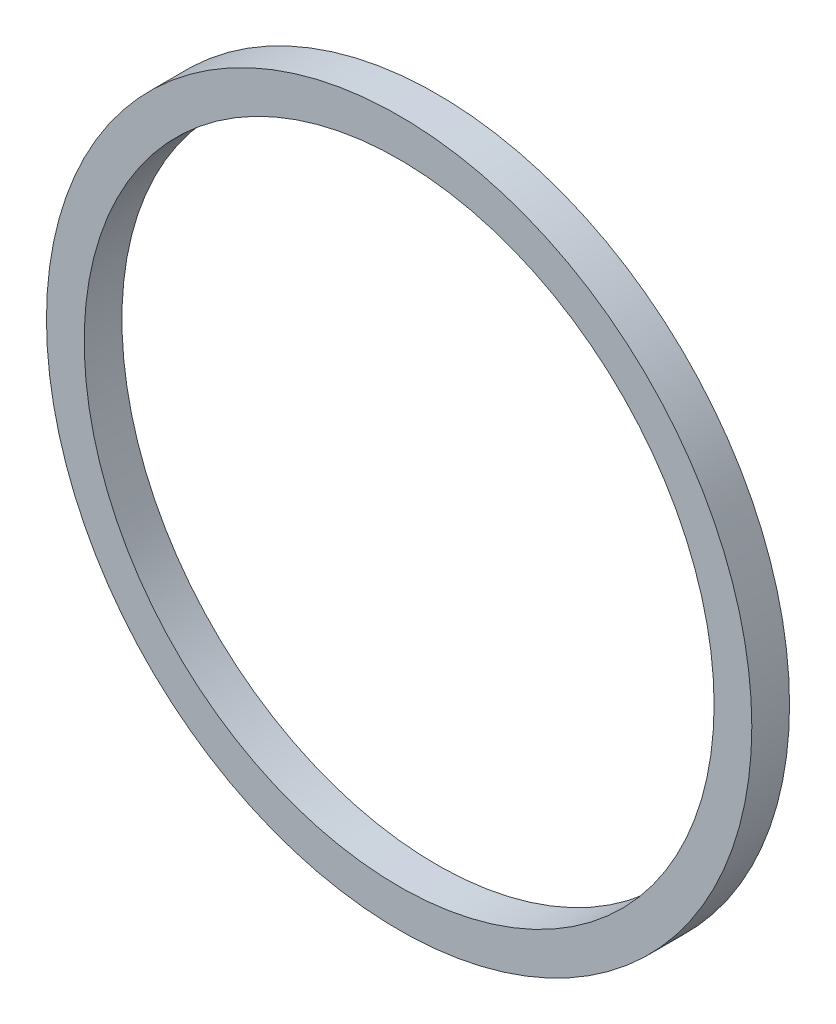
ISO-10303-21;
HEADER;
FILE_DESCRIPTION(('STEP AP214'),'2;1');
FILE_NAME('part.step','',(''),(''),'','','');
FILE_SCHEMA(('AUTOMOTIVE_DESIGN { 1 0 10303 214 1 1 1 1 }'));
ENDSEC;
DATA;
#1=APPLICATION_CONTEXT('core data for automotive mechanical design processes');
#2=APPLICATION_PROTOCOL_DEFINITION('international standard','automotive_design',2000,#1);
#3=PRODUCT_CONTEXT('',#1,'mechanical');
#4=PRODUCT('Part','Part','',(#3));
#5=PRODUCT_RELATED_PRODUCT_CATEGORY('part','',(#4));
#6=PRODUCT_DEFINITION_FORMATION('','',#4);
#7=PRODUCT_DEFINITION_CONTEXT('part definition',#1,'design');
#8=PRODUCT_DEFINITION('design','',#6,#7);
#9=PRODUCT_DEFINITION_SHAPE('','',#8);
#10=(LENGTH_UNIT() NAMED_UNIT(*) SI_UNIT(.MILLI.,.METRE.));
#11=(NAMED_UNIT(*) PLANE_ANGLE_UNIT() SI_UNIT($,.RADIAN.));
#12=(NAMED_UNIT(*) SI_UNIT($,.STERADIAN.) SOLID_ANGLE_UNIT());
#13=UNCERTAINTY_MEASURE_WITH_UNIT(LENGTH_MEASURE(1.E-05),#10,'distance_accuracy_value','');
#14=(GEOMETRIC_REPRESENTATION_CONTEXT(3) GLOBAL_UNCERTAINTY_ASSIGNED_CONTEXT((#13)) GLOBAL_UNIT_ASSIGNED_CONTEXT((#10,
#11,#12)) REPRESENTATION_CONTEXT('',''));
#15=CARTESIAN_POINT('',(0.,0.,0.));
#16=DIRECTION('',(0.,0.,1.));
#17=DIRECTION('',(1.,0.,0.));
#18=AXIS2_PLACEMENT_3D('',#15,#16,#17);
#19=CARTESIAN_POINT('',(0.,0.,2.54));
#20=DIRECTION('',(0.,0.,1.));
#21=DIRECTION('',(1.,0.,0.));
#22=AXIS2_PLACEMENT_3D('',#19,#20,#21);
#23=PLANE('',#22);
#24=CARTESIAN_POINT('',(0.,0.,2.54));
#25=DIRECTION('',(0.,0.,1.));
#26=DIRECTION('',(1.,0.,0.));
#27=AXIS2_PLACEMENT_3D('',#24,#25,#26);
#28=CIRCLE('',#27,23.749);
#29=CARTESIAN_POINT('',(23.749,0.,2.54));
#30=VERTEX_POINT('',#29);
#31=EDGE_CURVE('E10',#30,#30,#28,.T.);
#32=ORIENTED_EDGE('',*,*,#31,.T.);
#33=EDGE_LOOP('',(#32));
#34=FACE_BOUND('',#33,.T.);
#35=CARTESIAN_POINT('',(0.,0.,2.54));
#36=DIRECTION('',(0.,0.,1.));
#37=DIRECTION('',(1.,0.,0.));
#38=AXIS2_PLACEMENT_3D('',#35,#36,#37);
#39=CIRCLE('',#38,21.209);
#40=CARTESIAN_POINT('',(21.209,0.,2.54));
#41=VERTEX_POINT('',#40);
#42=EDGE_CURVE('E42',#41,#41,#39,.T.);
#43=ORIENTED_EDGE('',*,*,#42,.F.);
#44=EDGE_LOOP('',(#43));
#45=FACE_BOUND('',#44,.T.);
#46=ADVANCED_FACE('F31',(#34,#45),#23,.T.);
#47=CARTESIAN_POINT('',(0.,0.,0.));
#48=DIRECTION('',(0.,0.,1.));
#49=DIRECTION('',(1.,0.,0.));
#50=AXIS2_PLACEMENT_3D('',#47,#48,#49);
#51=PLANE('',#50);
#52=CARTESIAN_POINT('',(0.,0.,0.));
#53=DIRECTION('',(0.,0.,1.));
#54=DIRECTION('',(1.,0.,0.));
#55=AXIS2_PLACEMENT_3D('',#52,#53,#54);
#56=CIRCLE('',#55,23.749);
#57=CARTESIAN_POINT('',(23.749,0.,0.));
#58=VERTEX_POINT('',#57);
#59=EDGE_CURVE('E35',#58,#58,#56,.T.);
#60=ORIENTED_EDGE('',*,*,#59,.F.);
#61=EDGE_LOOP('',(#60));
#62=FACE_BOUND('',#61,.T.);
#63=CARTESIAN_POINT('',(0.,0.,0.));
#64=DIRECTION('',(0.,0.,1.));
#65=DIRECTION('',(1.,0.,0.));
#66=AXIS2_PLACEMENT_3D('',#63,#64,#65);
#67=CIRCLE('',#66,21.209);
#68=CARTESIAN_POINT('',(21.209,0.,0.));
#69=VERTEX_POINT('',#68);
#70=EDGE_CURVE('E44',#69,#69,#67,.T.);
#71=ORIENTED_EDGE('',*,*,#70,.T.);
#72=EDGE_LOOP('',(#71));
#73=FACE_BOUND('',#72,.T.);
#74=ADVANCED_FACE('F54',(#62,#73),#51,.F.);
#75=CARTESIAN_POINT('',(0.,0.,2.54));
#76=DIRECTION('',(0.,0.,-1.));
#77=DIRECTION('',(-1.,0.,0.));
#78=AXIS2_PLACEMENT_3D('',#75,#76,#77);
#79=CYLINDRICAL_SURFACE('',#78,23.749);
#80=ORIENTED_EDGE('',*,*,#31,.F.);
#81=EDGE_LOOP('',(#80));
#82=FACE_BOUND('',#81,.T.);
#83=ORIENTED_EDGE('',*,*,#59,.T.);
#84=EDGE_LOOP('',(#83));
#85=FACE_BOUND('',#84,.T.);
#86=ADVANCED_FACE('F33',(#82,#85),#79,.T.);
#87=CARTESIAN_POINT('',(0.,0.,2.54));
#88=DIRECTION('',(0.,0.,-1.));
#89=DIRECTION('',(-1.,0.,0.));
#90=AXIS2_PLACEMENT_3D('',#87,#88,#89);
#91=CYLINDRICAL_SURFACE('',#90,21.209);
#92=ORIENTED_EDGE('',*,*,#42,.T.);
#93=EDGE_LOOP('',(#92));
#94=FACE_BOUND('',#93,.T.);
#95=ORIENTED_EDGE('',*,*,#70,.F.);
#96=EDGE_LOOP('',(#95));
#97=FACE_BOUND('',#96,.T.);
#98=ADVANCED_FACE('F50',(#94,#97),#91,.F.);
#99=CLOSED_SHELL('',(#46,#74,#86,#98));
#100=MANIFOLD_SOLID_BREP('B2',#99);
#101=ADVANCED_BREP_SHAPE_REPRESENTATION('',(#18,#100),#14);
#102=SHAPE_DEFINITION_REPRESENTATION(#9,#101);
ENDSEC;
END-ISO-10303-21;
